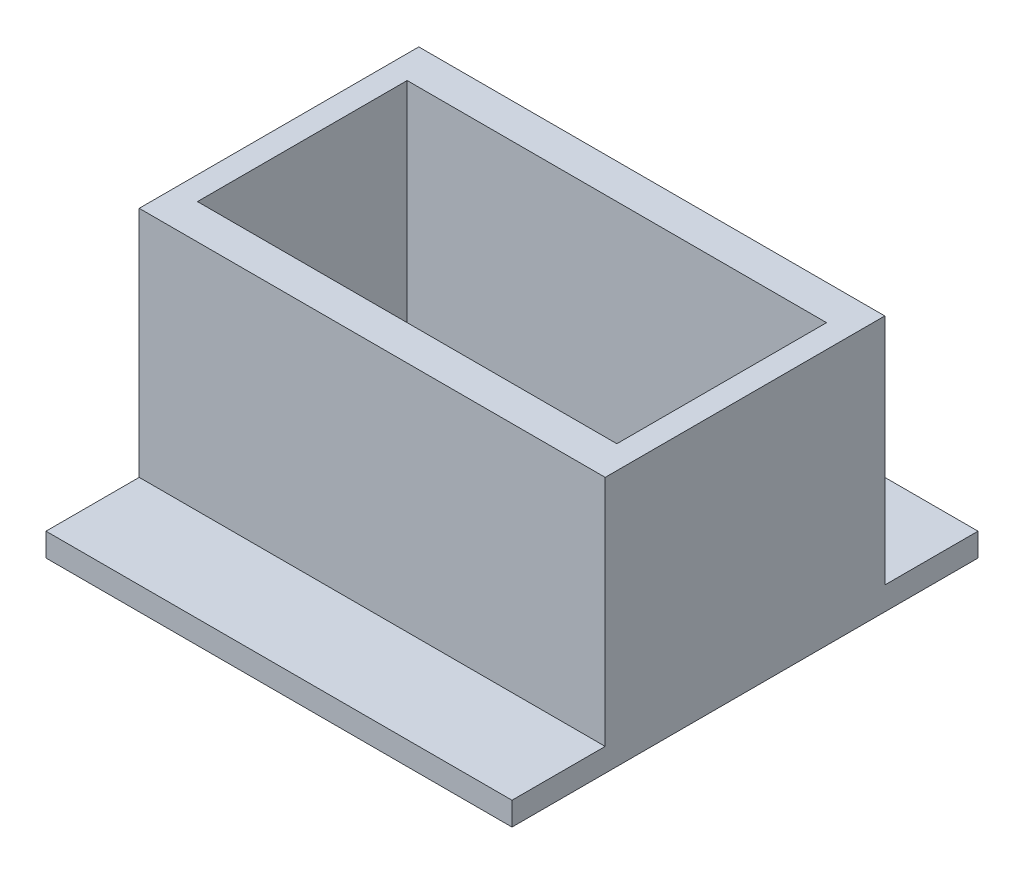
ISO-10303-21;
HEADER;
FILE_DESCRIPTION(('STEP AP214'),'2;1');
FILE_NAME('part.step','',(''),(''),'','','');
FILE_SCHEMA(('AUTOMOTIVE_DESIGN { 1 0 10303 214 1 1 1 1 }'));
ENDSEC;
DATA;
#1=APPLICATION_CONTEXT('core data for automotive mechanical design processes');
#2=APPLICATION_PROTOCOL_DEFINITION('international standard','automotive_design',2000,#1);
#3=PRODUCT_CONTEXT('',#1,'mechanical');
#4=PRODUCT('Part','Part','',(#3));
#5=PRODUCT_RELATED_PRODUCT_CATEGORY('part','',(#4));
#6=PRODUCT_DEFINITION_FORMATION('','',#4);
#7=PRODUCT_DEFINITION_CONTEXT('part definition',#1,'design');
#8=PRODUCT_DEFINITION('design','',#6,#7);
#9=PRODUCT_DEFINITION_SHAPE('','',#8);
#10=(LENGTH_UNIT() NAMED_UNIT(*) SI_UNIT(.MILLI.,.METRE.));
#11=(NAMED_UNIT(*) PLANE_ANGLE_UNIT() SI_UNIT($,.RADIAN.));
#12=(NAMED_UNIT(*) SI_UNIT($,.STERADIAN.) SOLID_ANGLE_UNIT());
#13=UNCERTAINTY_MEASURE_WITH_UNIT(LENGTH_MEASURE(1.E-05),#10,'distance_accuracy_value','');
#14=(GEOMETRIC_REPRESENTATION_CONTEXT(3) GLOBAL_UNCERTAINTY_ASSIGNED_CONTEXT((#13)) GLOBAL_UNIT_ASSIGNED_CONTEXT((#10,
#11,#12)) REPRESENTATION_CONTEXT('',''));
#15=CARTESIAN_POINT('',(0.,0.,0.));
#16=DIRECTION('',(0.,0.,1.));
#17=DIRECTION('',(1.,0.,0.));
#18=AXIS2_PLACEMENT_3D('',#15,#16,#17);
#19=CARTESIAN_POINT('',(0.,2.54,0.));
#20=DIRECTION('',(0.,0.,-1.));
#21=DIRECTION('',(-1.,0.,0.));
#22=AXIS2_PLACEMENT_3D('',#19,#20,#21);
#23=PLANE('',#22);
#24=DIRECTION('',(1.,0.,0.));
#25=VECTOR('',#24,1.);
#26=CARTESIAN_POINT('',(50.8,2.54,0.));
#27=LINE('',#26,#25);
#28=CARTESIAN_POINT('',(0.,2.54,0.));
#29=VERTEX_POINT('',#28);
#30=CARTESIAN_POINT('',(50.8,2.54,0.));
#31=VERTEX_POINT('',#30);
#32=EDGE_CURVE('E133',#29,#31,#27,.T.);
#33=ORIENTED_EDGE('',*,*,#32,.F.);
#34=DIRECTION('',(0.,-1.,0.));
#35=VECTOR('',#34,1.);
#36=CARTESIAN_POINT('',(0.,2.54,0.));
#37=LINE('',#36,#35);
#38=CARTESIAN_POINT('',(0.,0.,0.));
#39=VERTEX_POINT('',#38);
#40=EDGE_CURVE('E11',#29,#39,#37,.T.);
#41=ORIENTED_EDGE('',*,*,#40,.T.);
#42=DIRECTION('',(1.,0.,0.));
#43=VECTOR('',#42,1.);
#44=CARTESIAN_POINT('',(0.,0.,0.));
#45=LINE('',#44,#43);
#46=CARTESIAN_POINT('',(50.8,0.,0.));
#47=VERTEX_POINT('',#46);
#48=EDGE_CURVE('E199',#39,#47,#45,.T.);
#49=ORIENTED_EDGE('',*,*,#48,.T.);
#50=DIRECTION('',(0.,-1.,0.));
#51=VECTOR('',#50,1.);
#52=CARTESIAN_POINT('',(50.8,2.54,0.));
#53=LINE('',#52,#51);
#54=EDGE_CURVE('E41',#31,#47,#53,.T.);
#55=ORIENTED_EDGE('',*,*,#54,.F.);
#56=EDGE_LOOP('',(#33,#41,#49,#55));
#57=FACE_BOUND('',#56,.T.);
#58=ADVANCED_FACE('F33',(#57),#23,.F.);
#59=CARTESIAN_POINT('',(0.,2.54,-50.8));
#60=DIRECTION('',(0.,0.,1.));
#61=DIRECTION('',(1.,0.,0.));
#62=AXIS2_PLACEMENT_3D('',#59,#60,#61);
#63=PLANE('',#62);
#64=DIRECTION('',(-1.,0.,0.));
#65=VECTOR('',#64,1.);
#66=CARTESIAN_POINT('',(0.,2.54,-50.8));
#67=LINE('',#66,#65);
#68=CARTESIAN_POINT('',(50.8,2.54,-50.8));
#69=VERTEX_POINT('',#68);
#70=CARTESIAN_POINT('',(0.,2.54,-50.8));
#71=VERTEX_POINT('',#70);
#72=EDGE_CURVE('E156',#69,#71,#67,.T.);
#73=ORIENTED_EDGE('',*,*,#72,.F.);
#74=DIRECTION('',(0.,-1.,0.));
#75=VECTOR('',#74,1.);
#76=CARTESIAN_POINT('',(50.8,2.54,-50.8));
#77=LINE('',#76,#75);
#78=CARTESIAN_POINT('',(50.8,0.,-50.8));
#79=VERTEX_POINT('',#78);
#80=EDGE_CURVE('E210',#69,#79,#77,.T.);
#81=ORIENTED_EDGE('',*,*,#80,.T.);
#82=DIRECTION('',(-1.,0.,0.));
#83=VECTOR('',#82,1.);
#84=CARTESIAN_POINT('',(0.,0.,-50.8));
#85=LINE('',#84,#83);
#86=CARTESIAN_POINT('',(0.,0.,-50.8));
#87=VERTEX_POINT('',#86);
#88=EDGE_CURVE('E205',#79,#87,#85,.T.);
#89=ORIENTED_EDGE('',*,*,#88,.T.);
#90=DIRECTION('',(0.,-1.,0.));
#91=VECTOR('',#90,1.);
#92=CARTESIAN_POINT('',(0.,2.54,-50.8));
#93=LINE('',#92,#91);
#94=EDGE_CURVE('E208',#71,#87,#93,.T.);
#95=ORIENTED_EDGE('',*,*,#94,.F.);
#96=EDGE_LOOP('',(#73,#81,#89,#95));
#97=FACE_BOUND('',#96,.T.);
#98=ADVANCED_FACE('F223',(#97),#63,.F.);
#99=CARTESIAN_POINT('',(0.,2.54,0.));
#100=DIRECTION('',(1.,0.,0.));
#101=DIRECTION('',(0.,0.,-1.));
#102=AXIS2_PLACEMENT_3D('',#99,#100,#101);
#103=PLANE('',#102);
#104=DIRECTION('',(0.,0.,1.));
#105=VECTOR('',#104,1.);
#106=CARTESIAN_POINT('',(0.,2.54,0.));
#107=LINE('',#106,#105);
#108=CARTESIAN_POINT('',(0.,2.54,-10.16));
#109=VERTEX_POINT('',#108);
#110=EDGE_CURVE('E127',#109,#29,#107,.T.);
#111=ORIENTED_EDGE('',*,*,#110,.F.);
#112=DIRECTION('',(0.,1.,0.));
#113=VECTOR('',#112,1.);
#114=CARTESIAN_POINT('',(0.,2.54,-10.16));
#115=LINE('',#114,#113);
#116=CARTESIAN_POINT('',(0.,27.94,-10.16));
#117=VERTEX_POINT('',#116);
#118=EDGE_CURVE('E124',#109,#117,#115,.T.);
#119=ORIENTED_EDGE('',*,*,#118,.T.);
#120=DIRECTION('',(0.,0.,1.));
#121=VECTOR('',#120,1.);
#122=CARTESIAN_POINT('',(0.,27.94,-50.8));
#123=LINE('',#122,#121);
#124=CARTESIAN_POINT('',(0.,27.94,-40.64));
#125=VERTEX_POINT('',#124);
#126=EDGE_CURVE('E192',#125,#117,#123,.T.);
#127=ORIENTED_EDGE('',*,*,#126,.F.);
#128=DIRECTION('',(0.,1.,0.));
#129=VECTOR('',#128,1.);
#130=CARTESIAN_POINT('',(0.,2.54,-40.64));
#131=LINE('',#130,#129);
#132=CARTESIAN_POINT('',(0.,2.54,-40.64));
#133=VERTEX_POINT('',#132);
#134=EDGE_CURVE('E56',#133,#125,#131,.T.);
#135=ORIENTED_EDGE('',*,*,#134,.F.);
#136=DIRECTION('',(0.,0.,1.));
#137=VECTOR('',#136,1.);
#138=CARTESIAN_POINT('',(0.,2.54,-50.8));
#139=LINE('',#138,#137);
#140=EDGE_CURVE('E148',#71,#133,#139,.T.);
#141=ORIENTED_EDGE('',*,*,#140,.F.);
#142=ORIENTED_EDGE('',*,*,#94,.T.);
#143=DIRECTION('',(0.,0.,1.));
#144=VECTOR('',#143,1.);
#145=CARTESIAN_POINT('',(0.,0.,0.));
#146=LINE('',#145,#144);
#147=EDGE_CURVE('E196',#87,#39,#146,.T.);
#148=ORIENTED_EDGE('',*,*,#147,.T.);
#149=ORIENTED_EDGE('',*,*,#40,.F.);
#150=EDGE_LOOP('',(#111,#119,#127,#135,#141,#142,#148,#149));
#151=FACE_BOUND('',#150,.T.);
#152=ADVANCED_FACE('F35',(#151),#103,.F.);
#153=CARTESIAN_POINT('',(50.8,2.54,0.));
#154=DIRECTION('',(-1.,0.,0.));
#155=DIRECTION('',(0.,0.,1.));
#156=AXIS2_PLACEMENT_3D('',#153,#154,#155);
#157=PLANE('',#156);
#158=DIRECTION('',(0.,0.,-1.));
#159=VECTOR('',#158,1.);
#160=CARTESIAN_POINT('',(50.8,27.94,-50.8));
#161=LINE('',#160,#159);
#162=CARTESIAN_POINT('',(50.8,27.94,-10.16));
#163=VERTEX_POINT('',#162);
#164=CARTESIAN_POINT('',(50.8,27.94,-40.64));
#165=VERTEX_POINT('',#164);
#166=EDGE_CURVE('E141',#163,#165,#161,.T.);
#167=ORIENTED_EDGE('',*,*,#166,.F.);
#168=DIRECTION('',(0.,1.,0.));
#169=VECTOR('',#168,1.);
#170=CARTESIAN_POINT('',(50.8,2.54,-10.16));
#171=LINE('',#170,#169);
#172=CARTESIAN_POINT('',(50.8,2.54,-10.16));
#173=VERTEX_POINT('',#172);
#174=EDGE_CURVE('E48',#173,#163,#171,.T.);
#175=ORIENTED_EDGE('',*,*,#174,.F.);
#176=DIRECTION('',(0.,0.,-1.));
#177=VECTOR('',#176,1.);
#178=CARTESIAN_POINT('',(50.8,2.54,0.));
#179=LINE('',#178,#177);
#180=EDGE_CURVE('E128',#31,#173,#179,.T.);
#181=ORIENTED_EDGE('',*,*,#180,.F.);
#182=ORIENTED_EDGE('',*,*,#54,.T.);
#183=DIRECTION('',(0.,0.,-1.));
#184=VECTOR('',#183,1.);
#185=CARTESIAN_POINT('',(50.8,0.,0.));
#186=LINE('',#185,#184);
#187=EDGE_CURVE('E202',#47,#79,#186,.T.);
#188=ORIENTED_EDGE('',*,*,#187,.T.);
#189=ORIENTED_EDGE('',*,*,#80,.F.);
#190=DIRECTION('',(0.,0.,-1.));
#191=VECTOR('',#190,1.);
#192=CARTESIAN_POINT('',(50.8,2.54,-50.8));
#193=LINE('',#192,#191);
#194=CARTESIAN_POINT('',(50.8,2.54,-40.64));
#195=VERTEX_POINT('',#194);
#196=EDGE_CURVE('E154',#195,#69,#193,.T.);
#197=ORIENTED_EDGE('',*,*,#196,.F.);
#198=DIRECTION('',(0.,1.,0.));
#199=VECTOR('',#198,1.);
#200=CARTESIAN_POINT('',(50.8,2.54,-40.64));
#201=LINE('',#200,#199);
#202=EDGE_CURVE('E159',#195,#165,#201,.T.);
#203=ORIENTED_EDGE('',*,*,#202,.T.);
#204=EDGE_LOOP('',(#167,#175,#181,#182,#188,#189,#197,#203));
#205=FACE_BOUND('',#204,.T.);
#206=ADVANCED_FACE('F139',(#205),#157,.F.);
#207=CARTESIAN_POINT('',(0.,0.,0.));
#208=DIRECTION('',(0.,-1.,0.));
#209=DIRECTION('',(0.,0.,-1.));
#210=AXIS2_PLACEMENT_3D('',#207,#208,#209);
#211=PLANE('',#210);
#212=ORIENTED_EDGE('',*,*,#147,.F.);
#213=ORIENTED_EDGE('',*,*,#88,.F.);
#214=ORIENTED_EDGE('',*,*,#187,.F.);
#215=ORIENTED_EDGE('',*,*,#48,.F.);
#216=EDGE_LOOP('',(#212,#213,#214,#215));
#217=FACE_BOUND('',#216,.T.);
#218=ADVANCED_FACE('F219',(#217),#211,.T.);
#219=CARTESIAN_POINT('',(0.,27.94,0.));
#220=DIRECTION('',(0.,1.,0.));
#221=DIRECTION('',(0.,0.,1.));
#222=AXIS2_PLACEMENT_3D('',#219,#220,#221);
#223=PLANE('',#222);
#224=DIRECTION('',(-1.,0.,0.));
#225=VECTOR('',#224,1.);
#226=CARTESIAN_POINT('',(50.8,27.94,-10.16));
#227=LINE('',#226,#225);
#228=EDGE_CURVE('E136',#163,#117,#227,.T.);
#229=ORIENTED_EDGE('',*,*,#228,.F.);
#230=ORIENTED_EDGE('',*,*,#166,.T.);
#231=DIRECTION('',(1.,0.,0.));
#232=VECTOR('',#231,1.);
#233=CARTESIAN_POINT('',(0.,27.94,-40.64));
#234=LINE('',#233,#232);
#235=EDGE_CURVE('E143',#125,#165,#234,.T.);
#236=ORIENTED_EDGE('',*,*,#235,.F.);
#237=ORIENTED_EDGE('',*,*,#126,.T.);
#238=EDGE_LOOP('',(#229,#230,#236,#237));
#239=FACE_BOUND('',#238,.T.);
#240=DIRECTION('',(1.,0.,0.));
#241=VECTOR('',#240,1.);
#242=CARTESIAN_POINT('',(2.54,27.94,-13.97));
#243=LINE('',#242,#241);
#244=CARTESIAN_POINT('',(2.54,27.94,-13.97));
#245=VERTEX_POINT('',#244);
#246=CARTESIAN_POINT('',(48.26,27.94,-13.97));
#247=VERTEX_POINT('',#246);
#248=EDGE_CURVE('E165',#245,#247,#243,.T.);
#249=ORIENTED_EDGE('',*,*,#248,.F.);
#250=DIRECTION('',(0.,0.,1.));
#251=VECTOR('',#250,1.);
#252=CARTESIAN_POINT('',(2.54,27.94,-36.83));
#253=LINE('',#252,#251);
#254=CARTESIAN_POINT('',(2.54,27.94,-36.83));
#255=VERTEX_POINT('',#254);
#256=EDGE_CURVE('E163',#255,#245,#253,.T.);
#257=ORIENTED_EDGE('',*,*,#256,.F.);
#258=DIRECTION('',(-1.,0.,0.));
#259=VECTOR('',#258,1.);
#260=CARTESIAN_POINT('',(2.54,27.94,-36.83));
#261=LINE('',#260,#259);
#262=CARTESIAN_POINT('',(48.26,27.94,-36.83));
#263=VERTEX_POINT('',#262);
#264=EDGE_CURVE('E171',#263,#255,#261,.T.);
#265=ORIENTED_EDGE('',*,*,#264,.F.);
#266=DIRECTION('',(0.,0.,-1.));
#267=VECTOR('',#266,1.);
#268=CARTESIAN_POINT('',(48.26,27.94,-36.83));
#269=LINE('',#268,#267);
#270=EDGE_CURVE('E168',#247,#263,#269,.T.);
#271=ORIENTED_EDGE('',*,*,#270,.F.);
#272=EDGE_LOOP('',(#249,#257,#265,#271));
#273=FACE_BOUND('',#272,.T.);
#274=ADVANCED_FACE('F231',(#239,#273),#223,.T.);
#275=CARTESIAN_POINT('',(2.54,27.94,-36.83));
#276=DIRECTION('',(1.,0.,0.));
#277=DIRECTION('',(0.,0.,-1.));
#278=AXIS2_PLACEMENT_3D('',#275,#276,#277);
#279=PLANE('',#278);
#280=DIRECTION('',(0.,0.,1.));
#281=VECTOR('',#280,1.);
#282=CARTESIAN_POINT('',(2.54,2.54,-36.83));
#283=LINE('',#282,#281);
#284=CARTESIAN_POINT('',(2.54,2.54,-36.83));
#285=VERTEX_POINT('',#284);
#286=CARTESIAN_POINT('',(2.54,2.54,-13.97));
#287=VERTEX_POINT('',#286);
#288=EDGE_CURVE('E161',#285,#287,#283,.T.);
#289=ORIENTED_EDGE('',*,*,#288,.F.);
#290=DIRECTION('',(0.,-1.,0.));
#291=VECTOR('',#290,1.);
#292=CARTESIAN_POINT('',(2.54,27.94,-36.83));
#293=LINE('',#292,#291);
#294=EDGE_CURVE('E173',#255,#285,#293,.T.);
#295=ORIENTED_EDGE('',*,*,#294,.F.);
#296=ORIENTED_EDGE('',*,*,#256,.T.);
#297=DIRECTION('',(0.,-1.,0.));
#298=VECTOR('',#297,1.);
#299=CARTESIAN_POINT('',(2.54,27.94,-13.97));
#300=LINE('',#299,#298);
#301=EDGE_CURVE('E189',#245,#287,#300,.T.);
#302=ORIENTED_EDGE('',*,*,#301,.T.);
#303=EDGE_LOOP('',(#289,#295,#296,#302));
#304=FACE_BOUND('',#303,.T.);
#305=ADVANCED_FACE('F255',(#304),#279,.T.);
#306=CARTESIAN_POINT('',(2.54,27.94,-13.97));
#307=DIRECTION('',(0.,0.,-1.));
#308=DIRECTION('',(-1.,0.,0.));
#309=AXIS2_PLACEMENT_3D('',#306,#307,#308);
#310=PLANE('',#309);
#311=DIRECTION('',(1.,0.,0.));
#312=VECTOR('',#311,1.);
#313=CARTESIAN_POINT('',(2.54,2.54,-13.97));
#314=LINE('',#313,#312);
#315=CARTESIAN_POINT('',(48.26,2.54,-13.97));
#316=VERTEX_POINT('',#315);
#317=EDGE_CURVE('E176',#287,#316,#314,.T.);
#318=ORIENTED_EDGE('',*,*,#317,.F.);
#319=ORIENTED_EDGE('',*,*,#301,.F.);
#320=ORIENTED_EDGE('',*,*,#248,.T.);
#321=DIRECTION('',(0.,-1.,0.));
#322=VECTOR('',#321,1.);
#323=CARTESIAN_POINT('',(48.26,27.94,-13.97));
#324=LINE('',#323,#322);
#325=EDGE_CURVE('E187',#247,#316,#324,.T.);
#326=ORIENTED_EDGE('',*,*,#325,.T.);
#327=EDGE_LOOP('',(#318,#319,#320,#326));
#328=FACE_BOUND('',#327,.T.);
#329=ADVANCED_FACE('F258',(#328),#310,.T.);
#330=CARTESIAN_POINT('',(48.26,27.94,-36.83));
#331=DIRECTION('',(-1.,0.,0.));
#332=DIRECTION('',(0.,0.,1.));
#333=AXIS2_PLACEMENT_3D('',#330,#331,#332);
#334=PLANE('',#333);
#335=DIRECTION('',(0.,0.,-1.));
#336=VECTOR('',#335,1.);
#337=CARTESIAN_POINT('',(48.26,2.54,-36.83));
#338=LINE('',#337,#336);
#339=CARTESIAN_POINT('',(48.26,2.54,-36.83));
#340=VERTEX_POINT('',#339);
#341=EDGE_CURVE('E179',#316,#340,#338,.T.);
#342=ORIENTED_EDGE('',*,*,#341,.F.);
#343=ORIENTED_EDGE('',*,*,#325,.F.);
#344=ORIENTED_EDGE('',*,*,#270,.T.);
#345=DIRECTION('',(0.,-1.,0.));
#346=VECTOR('',#345,1.);
#347=CARTESIAN_POINT('',(48.26,27.94,-36.83));
#348=LINE('',#347,#346);
#349=EDGE_CURVE('E185',#263,#340,#348,.T.);
#350=ORIENTED_EDGE('',*,*,#349,.T.);
#351=EDGE_LOOP('',(#342,#343,#344,#350));
#352=FACE_BOUND('',#351,.T.);
#353=ADVANCED_FACE('F262',(#352),#334,.T.);
#354=CARTESIAN_POINT('',(2.54,27.94,-36.83));
#355=DIRECTION('',(0.,0.,1.));
#356=DIRECTION('',(1.,0.,0.));
#357=AXIS2_PLACEMENT_3D('',#354,#355,#356);
#358=PLANE('',#357);
#359=DIRECTION('',(-1.,0.,0.));
#360=VECTOR('',#359,1.);
#361=CARTESIAN_POINT('',(2.54,2.54,-36.83));
#362=LINE('',#361,#360);
#363=EDGE_CURVE('E166',#340,#285,#362,.T.);
#364=ORIENTED_EDGE('',*,*,#363,.F.);
#365=ORIENTED_EDGE('',*,*,#349,.F.);
#366=ORIENTED_EDGE('',*,*,#264,.T.);
#367=ORIENTED_EDGE('',*,*,#294,.T.);
#368=EDGE_LOOP('',(#364,#365,#366,#367));
#369=FACE_BOUND('',#368,.T.);
#370=ADVANCED_FACE('F251',(#369),#358,.T.);
#371=CARTESIAN_POINT('',(0.,2.54,0.));
#372=DIRECTION('',(0.,-1.,0.));
#373=DIRECTION('',(0.,0.,-1.));
#374=AXIS2_PLACEMENT_3D('',#371,#372,#373);
#375=PLANE('',#374);
#376=ORIENTED_EDGE('',*,*,#363,.T.);
#377=ORIENTED_EDGE('',*,*,#288,.T.);
#378=ORIENTED_EDGE('',*,*,#317,.T.);
#379=ORIENTED_EDGE('',*,*,#341,.T.);
#380=EDGE_LOOP('',(#376,#377,#378,#379));
#381=FACE_BOUND('',#380,.T.);
#382=ADVANCED_FACE('F248',(#381),#375,.F.);
#383=CARTESIAN_POINT('',(0.,2.54,-40.64));
#384=DIRECTION('',(0.,0.,1.));
#385=DIRECTION('',(1.,0.,0.));
#386=AXIS2_PLACEMENT_3D('',#383,#384,#385);
#387=PLANE('',#386);
#388=ORIENTED_EDGE('',*,*,#235,.T.);
#389=ORIENTED_EDGE('',*,*,#202,.F.);
#390=DIRECTION('',(1.,0.,0.));
#391=VECTOR('',#390,1.);
#392=CARTESIAN_POINT('',(0.,2.54,-40.64));
#393=LINE('',#392,#391);
#394=EDGE_CURVE('E151',#133,#195,#393,.T.);
#395=ORIENTED_EDGE('',*,*,#394,.F.);
#396=ORIENTED_EDGE('',*,*,#134,.T.);
#397=EDGE_LOOP('',(#388,#389,#395,#396));
#398=FACE_BOUND('',#397,.T.);
#399=ADVANCED_FACE('F228',(#398),#387,.F.);
#400=CARTESIAN_POINT('',(0.,2.54,0.));
#401=DIRECTION('',(0.,1.,0.));
#402=DIRECTION('',(0.,0.,1.));
#403=AXIS2_PLACEMENT_3D('',#400,#401,#402);
#404=PLANE('',#403);
#405=ORIENTED_EDGE('',*,*,#140,.T.);
#406=ORIENTED_EDGE('',*,*,#394,.T.);
#407=ORIENTED_EDGE('',*,*,#196,.T.);
#408=ORIENTED_EDGE('',*,*,#72,.T.);
#409=EDGE_LOOP('',(#405,#406,#407,#408));
#410=FACE_BOUND('',#409,.T.);
#411=ADVANCED_FACE('F226',(#410),#404,.T.);
#412=CARTESIAN_POINT('',(50.8,2.54,-10.16));
#413=DIRECTION('',(0.,0.,-1.));
#414=DIRECTION('',(-1.,0.,0.));
#415=AXIS2_PLACEMENT_3D('',#412,#413,#414);
#416=PLANE('',#415);
#417=ORIENTED_EDGE('',*,*,#228,.T.);
#418=ORIENTED_EDGE('',*,*,#118,.F.);
#419=DIRECTION('',(-1.,0.,0.));
#420=VECTOR('',#419,1.);
#421=CARTESIAN_POINT('',(50.8,2.54,-10.16));
#422=LINE('',#421,#420);
#423=EDGE_CURVE('E120',#173,#109,#422,.T.);
#424=ORIENTED_EDGE('',*,*,#423,.F.);
#425=ORIENTED_EDGE('',*,*,#174,.T.);
#426=EDGE_LOOP('',(#417,#418,#424,#425));
#427=FACE_BOUND('',#426,.T.);
#428=ADVANCED_FACE('F122',(#427),#416,.F.);
#429=CARTESIAN_POINT('',(0.,2.54,0.));
#430=DIRECTION('',(0.,1.,0.));
#431=DIRECTION('',(0.,0.,1.));
#432=AXIS2_PLACEMENT_3D('',#429,#430,#431);
#433=PLANE('',#432);
#434=ORIENTED_EDGE('',*,*,#180,.T.);
#435=ORIENTED_EDGE('',*,*,#423,.T.);
#436=ORIENTED_EDGE('',*,*,#110,.T.);
#437=ORIENTED_EDGE('',*,*,#32,.T.);
#438=EDGE_LOOP('',(#434,#435,#436,#437));
#439=FACE_BOUND('',#438,.T.);
#440=ADVANCED_FACE('F131',(#439),#433,.T.);
#441=CLOSED_SHELL('',(#58,#98,#152,#206,#218,#274,#305,#329,#353,#370,#382,#399,#411,#428,#440));
#442=MANIFOLD_SOLID_BREP('B2',#441);
#443=ADVANCED_BREP_SHAPE_REPRESENTATION('',(#18,#442),#14);
#444=SHAPE_DEFINITION_REPRESENTATION(#9,#443);
ENDSEC;
END-ISO-10303-21;
